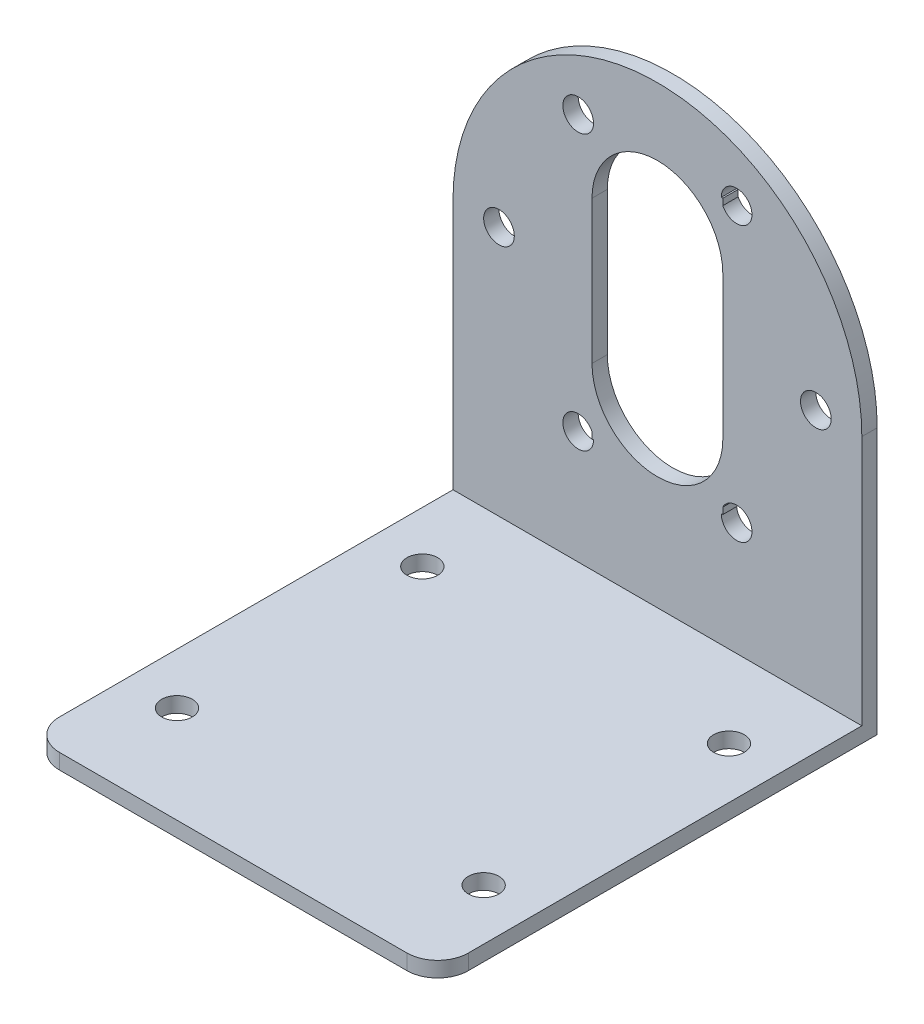
ISO-10303-21;
HEADER;
FILE_DESCRIPTION(('STEP AP214'),'2;1');
FILE_NAME('part.step','',(''),(''),'','','');
FILE_SCHEMA(('AUTOMOTIVE_DESIGN { 1 0 10303 214 1 1 1 1 }'));
ENDSEC;
DATA;
#1=APPLICATION_CONTEXT('core data for automotive mechanical design processes');
#2=APPLICATION_PROTOCOL_DEFINITION('international standard','automotive_design',2000,#1);
#3=PRODUCT_CONTEXT('',#1,'mechanical');
#4=PRODUCT('Part','Part','',(#3));
#5=PRODUCT_RELATED_PRODUCT_CATEGORY('part','',(#4));
#6=PRODUCT_DEFINITION_FORMATION('','',#4);
#7=PRODUCT_DEFINITION_CONTEXT('part definition',#1,'design');
#8=PRODUCT_DEFINITION('design','',#6,#7);
#9=PRODUCT_DEFINITION_SHAPE('','',#8);
#10=(LENGTH_UNIT() NAMED_UNIT(*) SI_UNIT(.MILLI.,.METRE.));
#11=(NAMED_UNIT(*) PLANE_ANGLE_UNIT() SI_UNIT($,.RADIAN.));
#12=(NAMED_UNIT(*) SI_UNIT($,.STERADIAN.) SOLID_ANGLE_UNIT());
#13=UNCERTAINTY_MEASURE_WITH_UNIT(LENGTH_MEASURE(1.E-05),#10,'distance_accuracy_value','');
#14=(GEOMETRIC_REPRESENTATION_CONTEXT(3) GLOBAL_UNCERTAINTY_ASSIGNED_CONTEXT((#13)) GLOBAL_UNIT_ASSIGNED_CONTEXT((#10,
#11,#12)) REPRESENTATION_CONTEXT('',''));
#15=CARTESIAN_POINT('',(0.,0.,0.));
#16=DIRECTION('',(0.,0.,1.));
#17=DIRECTION('',(1.,0.,0.));
#18=AXIS2_PLACEMENT_3D('',#15,#16,#17);
#19=CARTESIAN_POINT('',(20.,26.,1.5));
#20=DIRECTION('',(0.,0.,1.));
#21=DIRECTION('',(1.,0.,0.));
#22=AXIS2_PLACEMENT_3D('',#19,#20,#21);
#23=PLANE('',#22);
#24=CARTESIAN_POINT('',(4.49999999999999,26.,1.5));
#25=DIRECTION('',(0.,0.,1.));
#26=DIRECTION('',(1.,0.,0.));
#27=AXIS2_PLACEMENT_3D('',#24,#25,#26);
#28=CIRCLE('',#27,1.5);
#29=CARTESIAN_POINT('',(5.99999999999999,26.,1.5));
#30=VERTEX_POINT('',#29);
#31=EDGE_CURVE('E339',#30,#30,#28,.T.);
#32=ORIENTED_EDGE('',*,*,#31,.F.);
#33=EDGE_LOOP('',(#32));
#34=FACE_BOUND('',#33,.T.);
#35=CARTESIAN_POINT('',(35.5,25.9999999999999,1.5));
#36=DIRECTION('',(0.,0.,1.));
#37=DIRECTION('',(1.,0.,0.));
#38=AXIS2_PLACEMENT_3D('',#35,#36,#37);
#39=CIRCLE('',#38,1.5);
#40=CARTESIAN_POINT('',(37.,25.9999999999999,1.5));
#41=VERTEX_POINT('',#40);
#42=EDGE_CURVE('E604',#41,#41,#39,.T.);
#43=ORIENTED_EDGE('',*,*,#42,.F.);
#44=EDGE_LOOP('',(#43));
#45=FACE_BOUND('',#44,.T.);
#46=CARTESIAN_POINT('',(12.25,39.4233937586588,1.5));
#47=DIRECTION('',(0.,0.,1.));
#48=DIRECTION('',(1.,0.,0.));
#49=AXIS2_PLACEMENT_3D('',#46,#47,#48);
#50=CIRCLE('',#49,1.5);
#51=CARTESIAN_POINT('',(13.75,39.4233937586588,1.5));
#52=VERTEX_POINT('',#51);
#53=EDGE_CURVE('E297',#52,#52,#50,.T.);
#54=ORIENTED_EDGE('',*,*,#53,.F.);
#55=EDGE_LOOP('',(#54));
#56=FACE_BOUND('',#55,.T.);
#57=DIRECTION('',(0.,-1.,0.));
#58=VECTOR('',#57,1.);
#59=CARTESIAN_POINT('',(26.3999999999996,-2.90569260220752E-13,1.5));
#60=LINE('',#59,#58);
#61=CARTESIAN_POINT('',(26.4,39.4,1.5));
#62=VERTEX_POINT('',#61);
#63=CARTESIAN_POINT('',(26.4000000000003,38.7695589171272,1.5));
#64=VERTEX_POINT('',#63);
#65=EDGE_CURVE('E263',#62,#64,#60,.T.);
#66=ORIENTED_EDGE('',*,*,#65,.F.);
#67=DIRECTION('',(1.,0.,0.));
#68=VECTOR('',#67,1.);
#69=CARTESIAN_POINT('',(0.,39.4,1.5));
#70=LINE('',#69,#68);
#71=CARTESIAN_POINT('',(26.2501824337421,39.4,1.5));
#72=VERTEX_POINT('',#71);
#73=EDGE_CURVE('E274',#72,#62,#70,.T.);
#74=ORIENTED_EDGE('',*,*,#73,.F.);
#75=CARTESIAN_POINT('',(27.7500000000001,39.4233937586588,1.5));
#76=DIRECTION('',(0.,0.,1.));
#77=DIRECTION('',(1.,0.,0.));
#78=AXIS2_PLACEMENT_3D('',#75,#76,#77);
#79=CIRCLE('',#78,1.5);
#80=EDGE_CURVE('E279',#64,#72,#79,.T.);
#81=ORIENTED_EDGE('',*,*,#80,.F.);
#82=EDGE_LOOP('',(#66,#74,#81));
#83=FACE_BOUND('',#82,.T.);
#84=DIRECTION('',(-1.,0.,0.));
#85=VECTOR('',#84,1.);
#86=CARTESIAN_POINT('',(0.,1.5,1.5));
#87=LINE('',#86,#85);
#88=CARTESIAN_POINT('',(40.,1.5,1.5));
#89=VERTEX_POINT('',#88);
#90=CARTESIAN_POINT('',(0.,1.5,1.5));
#91=VERTEX_POINT('',#90);
#92=EDGE_CURVE('E365',#89,#91,#87,.T.);
#93=ORIENTED_EDGE('',*,*,#92,.F.);
#94=DIRECTION('',(0.,1.,0.));
#95=VECTOR('',#94,1.);
#96=CARTESIAN_POINT('',(40.,0.,1.5));
#97=LINE('',#96,#95);
#98=CARTESIAN_POINT('',(40.,26.,1.5));
#99=VERTEX_POINT('',#98);
#100=EDGE_CURVE('E382',#89,#99,#97,.T.);
#101=ORIENTED_EDGE('',*,*,#100,.T.);
#102=CARTESIAN_POINT('',(20.,26.,1.5));
#103=DIRECTION('',(0.,0.,1.));
#104=DIRECTION('',(1.,0.,0.));
#105=AXIS2_PLACEMENT_3D('',#102,#103,#104);
#106=CIRCLE('',#105,20.);
#107=CARTESIAN_POINT('',(0.,26.,1.5));
#108=VERTEX_POINT('',#107);
#109=EDGE_CURVE('E385',#99,#108,#106,.T.);
#110=ORIENTED_EDGE('',*,*,#109,.T.);
#111=DIRECTION('',(0.,-1.,0.));
#112=VECTOR('',#111,1.);
#113=CARTESIAN_POINT('',(0.,0.,1.5));
#114=LINE('',#113,#112);
#115=EDGE_CURVE('E379',#108,#91,#114,.T.);
#116=ORIENTED_EDGE('',*,*,#115,.T.);
#117=EDGE_LOOP('',(#93,#101,#110,#116));
#118=FACE_BOUND('',#117,.T.);
#119=CARTESIAN_POINT('',(27.7499999999999,12.5766062413411,1.5));
#120=DIRECTION('',(0.,0.,1.));
#121=DIRECTION('',(1.,0.,0.));
#122=AXIS2_PLACEMENT_3D('',#119,#120,#121);
#123=CIRCLE('',#122,1.5);
#124=CARTESIAN_POINT('',(26.250182433742,12.6,1.5));
#125=VERTEX_POINT('',#124);
#126=CARTESIAN_POINT('',(26.4,13.2304410828729,1.5));
#127=VERTEX_POINT('',#126);
#128=EDGE_CURVE('E300',#125,#127,#123,.T.);
#129=ORIENTED_EDGE('',*,*,#128,.F.);
#130=DIRECTION('',(1.,0.,0.));
#131=VECTOR('',#130,1.);
#132=CARTESIAN_POINT('',(0.,12.6,1.5));
#133=LINE('',#132,#131);
#134=CARTESIAN_POINT('',(26.4,12.6,1.5));
#135=VERTEX_POINT('',#134);
#136=EDGE_CURVE('E271',#125,#135,#133,.T.);
#137=ORIENTED_EDGE('',*,*,#136,.T.);
#138=DIRECTION('',(0.,-1.,0.));
#139=VECTOR('',#138,1.);
#140=CARTESIAN_POINT('',(26.4,0.,1.5));
#141=LINE('',#140,#139);
#142=EDGE_CURVE('E292',#127,#135,#141,.T.);
#143=ORIENTED_EDGE('',*,*,#142,.F.);
#144=EDGE_LOOP('',(#129,#137,#143));
#145=FACE_BOUND('',#144,.T.);
#146=CARTESIAN_POINT('',(12.2499999999998,12.5766062413413,1.5));
#147=DIRECTION('',(0.,0.,1.));
#148=DIRECTION('',(1.,0.,0.));
#149=AXIS2_PLACEMENT_3D('',#146,#147,#148);
#150=CIRCLE('',#149,1.5);
#151=CARTESIAN_POINT('',(13.6,13.230441082872,1.5));
#152=VERTEX_POINT('',#151);
#153=CARTESIAN_POINT('',(13.7498175662578,12.6,1.5));
#154=VERTEX_POINT('',#153);
#155=EDGE_CURVE('E333',#152,#154,#150,.T.);
#156=ORIENTED_EDGE('',*,*,#155,.F.);
#157=DIRECTION('',(0.,-1.,0.));
#158=VECTOR('',#157,1.);
#159=CARTESIAN_POINT('',(13.6,0.,1.5));
#160=LINE('',#159,#158);
#161=CARTESIAN_POINT('',(13.6,12.6,1.5));
#162=VERTEX_POINT('',#161);
#163=EDGE_CURVE('E336',#152,#162,#160,.T.);
#164=ORIENTED_EDGE('',*,*,#163,.T.);
#165=DIRECTION('',(1.,0.,0.));
#166=VECTOR('',#165,1.);
#167=CARTESIAN_POINT('',(0.,12.6,1.5));
#168=LINE('',#167,#166);
#169=EDGE_CURVE('E327',#162,#154,#168,.T.);
#170=ORIENTED_EDGE('',*,*,#169,.T.);
#171=EDGE_LOOP('',(#156,#164,#170));
#172=FACE_BOUND('',#171,.T.);
#173=DIRECTION('',(0.,-1.,0.));
#174=VECTOR('',#173,1.);
#175=CARTESIAN_POINT('',(26.4,0.,1.5));
#176=LINE('',#175,#174);
#177=CARTESIAN_POINT('',(26.4,33.,1.5));
#178=VERTEX_POINT('',#177);
#179=CARTESIAN_POINT('',(26.4,19.,1.5));
#180=VERTEX_POINT('',#179);
#181=EDGE_CURVE('E317',#178,#180,#176,.T.);
#182=ORIENTED_EDGE('',*,*,#181,.T.);
#183=CARTESIAN_POINT('',(20.,19.,1.5));
#184=DIRECTION('',(0.,0.,1.));
#185=DIRECTION('',(1.,0.,0.));
#186=AXIS2_PLACEMENT_3D('',#183,#184,#185);
#187=CIRCLE('',#186,6.4);
#188=CARTESIAN_POINT('',(13.6,19.,1.5));
#189=VERTEX_POINT('',#188);
#190=EDGE_CURVE('E320',#180,#189,#187,.F.);
#191=ORIENTED_EDGE('',*,*,#190,.T.);
#192=DIRECTION('',(0.,-1.,0.));
#193=VECTOR('',#192,1.);
#194=CARTESIAN_POINT('',(13.6,0.,1.5));
#195=LINE('',#194,#193);
#196=CARTESIAN_POINT('',(13.6,33.,1.5));
#197=VERTEX_POINT('',#196);
#198=EDGE_CURVE('E308',#197,#189,#195,.T.);
#199=ORIENTED_EDGE('',*,*,#198,.F.);
#200=CARTESIAN_POINT('',(20.,33.,1.5));
#201=DIRECTION('',(0.,0.,1.));
#202=DIRECTION('',(1.,0.,0.));
#203=AXIS2_PLACEMENT_3D('',#200,#201,#202);
#204=CIRCLE('',#203,6.4);
#205=EDGE_CURVE('E314',#178,#197,#204,.T.);
#206=ORIENTED_EDGE('',*,*,#205,.F.);
#207=EDGE_LOOP('',(#182,#191,#199,#206));
#208=FACE_BOUND('',#207,.T.);
#209=ADVANCED_FACE('F116',(#34,#45,#56,#83,#118,#145,#172,#208),#23,.T.);
#210=CARTESIAN_POINT('',(20.,26.,0.));
#211=DIRECTION('',(0.,0.,1.));
#212=DIRECTION('',(1.,0.,0.));
#213=AXIS2_PLACEMENT_3D('',#210,#211,#212);
#214=PLANE('',#213);
#215=CARTESIAN_POINT('',(4.49999999999999,26.,0.));
#216=DIRECTION('',(0.,0.,1.));
#217=DIRECTION('',(1.,0.,0.));
#218=AXIS2_PLACEMENT_3D('',#215,#216,#217);
#219=CIRCLE('',#218,1.5);
#220=CARTESIAN_POINT('',(5.99999999999999,26.,0.));
#221=VERTEX_POINT('',#220);
#222=EDGE_CURVE('E350',#221,#221,#219,.T.);
#223=ORIENTED_EDGE('',*,*,#222,.T.);
#224=EDGE_LOOP('',(#223));
#225=FACE_BOUND('',#224,.T.);
#226=CARTESIAN_POINT('',(35.5,25.9999999999999,0.));
#227=DIRECTION('',(0.,0.,1.));
#228=DIRECTION('',(1.,0.,0.));
#229=AXIS2_PLACEMENT_3D('',#226,#227,#228);
#230=CIRCLE('',#229,1.5);
#231=CARTESIAN_POINT('',(37.,25.9999999999999,0.));
#232=VERTEX_POINT('',#231);
#233=EDGE_CURVE('E441',#232,#232,#230,.T.);
#234=ORIENTED_EDGE('',*,*,#233,.T.);
#235=EDGE_LOOP('',(#234));
#236=FACE_BOUND('',#235,.T.);
#237=CARTESIAN_POINT('',(12.25,39.4233937586588,0.));
#238=DIRECTION('',(0.,0.,1.));
#239=DIRECTION('',(1.,0.,0.));
#240=AXIS2_PLACEMENT_3D('',#237,#238,#239);
#241=CIRCLE('',#240,1.5);
#242=CARTESIAN_POINT('',(13.75,39.4233937586588,0.));
#243=VERTEX_POINT('',#242);
#244=EDGE_CURVE('E438',#243,#243,#241,.T.);
#245=ORIENTED_EDGE('',*,*,#244,.T.);
#246=EDGE_LOOP('',(#245));
#247=FACE_BOUND('',#246,.T.);
#248=DIRECTION('',(0.,-1.,0.));
#249=VECTOR('',#248,1.);
#250=CARTESIAN_POINT('',(13.6,26.,0.));
#251=LINE('',#250,#249);
#252=CARTESIAN_POINT('',(13.6,13.230441082872,0.));
#253=VERTEX_POINT('',#252);
#254=CARTESIAN_POINT('',(13.6,12.6,0.));
#255=VERTEX_POINT('',#254);
#256=EDGE_CURVE('E425',#253,#255,#251,.T.);
#257=ORIENTED_EDGE('',*,*,#256,.F.);
#258=CARTESIAN_POINT('',(12.2499999999998,12.5766062413413,0.));
#259=DIRECTION('',(0.,0.,1.));
#260=DIRECTION('',(1.,0.,0.));
#261=AXIS2_PLACEMENT_3D('',#258,#259,#260);
#262=CIRCLE('',#261,1.5);
#263=CARTESIAN_POINT('',(13.7498175662578,12.6,0.));
#264=VERTEX_POINT('',#263);
#265=EDGE_CURVE('E419',#253,#264,#262,.T.);
#266=ORIENTED_EDGE('',*,*,#265,.T.);
#267=DIRECTION('',(1.,0.,0.));
#268=VECTOR('',#267,1.);
#269=CARTESIAN_POINT('',(20.,12.6,0.));
#270=LINE('',#269,#268);
#271=EDGE_CURVE('E422',#255,#264,#270,.T.);
#272=ORIENTED_EDGE('',*,*,#271,.F.);
#273=EDGE_LOOP('',(#257,#266,#272));
#274=FACE_BOUND('',#273,.T.);
#275=DIRECTION('',(1.,0.,0.));
#276=VECTOR('',#275,1.);
#277=CARTESIAN_POINT('',(20.,39.4,0.));
#278=LINE('',#277,#276);
#279=CARTESIAN_POINT('',(26.2501824337421,39.4,0.));
#280=VERTEX_POINT('',#279);
#281=CARTESIAN_POINT('',(26.4,39.4,0.));
#282=VERTEX_POINT('',#281);
#283=EDGE_CURVE('E416',#280,#282,#278,.T.);
#284=ORIENTED_EDGE('',*,*,#283,.T.);
#285=DIRECTION('',(0.,-1.,0.));
#286=VECTOR('',#285,1.);
#287=CARTESIAN_POINT('',(26.3999999999999,25.9999999999999,0.));
#288=LINE('',#287,#286);
#289=CARTESIAN_POINT('',(26.4,38.7695589171271,0.));
#290=VERTEX_POINT('',#289);
#291=EDGE_CURVE('E266',#282,#290,#288,.T.);
#292=ORIENTED_EDGE('',*,*,#291,.T.);
#293=CARTESIAN_POINT('',(27.7500000000001,39.4233937586588,0.));
#294=DIRECTION('',(0.,0.,1.));
#295=DIRECTION('',(1.,0.,0.));
#296=AXIS2_PLACEMENT_3D('',#293,#294,#295);
#297=CIRCLE('',#296,1.5);
#298=EDGE_CURVE('E413',#290,#280,#297,.T.);
#299=ORIENTED_EDGE('',*,*,#298,.T.);
#300=EDGE_LOOP('',(#284,#292,#299));
#301=FACE_BOUND('',#300,.T.);
#302=DIRECTION('',(0.,-1.,0.));
#303=VECTOR('',#302,1.);
#304=CARTESIAN_POINT('',(0.,0.,0.));
#305=LINE('',#304,#303);
#306=CARTESIAN_POINT('',(0.,26.,0.));
#307=VERTEX_POINT('',#306);
#308=CARTESIAN_POINT('',(0.,0.,0.));
#309=VERTEX_POINT('',#308);
#310=EDGE_CURVE('E378',#307,#309,#305,.T.);
#311=ORIENTED_EDGE('',*,*,#310,.F.);
#312=CARTESIAN_POINT('',(20.,26.,0.));
#313=DIRECTION('',(0.,0.,1.));
#314=DIRECTION('',(1.,0.,0.));
#315=AXIS2_PLACEMENT_3D('',#312,#313,#314);
#316=CIRCLE('',#315,20.);
#317=CARTESIAN_POINT('',(40.,26.,0.));
#318=VERTEX_POINT('',#317);
#319=EDGE_CURVE('E383',#318,#307,#316,.T.);
#320=ORIENTED_EDGE('',*,*,#319,.F.);
#321=DIRECTION('',(0.,1.,0.));
#322=VECTOR('',#321,1.);
#323=CARTESIAN_POINT('',(40.,0.,0.));
#324=LINE('',#323,#322);
#325=CARTESIAN_POINT('',(40.,0.,0.));
#326=VERTEX_POINT('',#325);
#327=EDGE_CURVE('E393',#326,#318,#324,.T.);
#328=ORIENTED_EDGE('',*,*,#327,.F.);
#329=DIRECTION('',(1.,0.,0.));
#330=VECTOR('',#329,1.);
#331=CARTESIAN_POINT('',(0.,0.,0.));
#332=LINE('',#331,#330);
#333=EDGE_CURVE('E390',#309,#326,#332,.T.);
#334=ORIENTED_EDGE('',*,*,#333,.F.);
#335=EDGE_LOOP('',(#311,#320,#328,#334));
#336=FACE_BOUND('',#335,.T.);
#337=DIRECTION('',(1.,0.,0.));
#338=VECTOR('',#337,1.);
#339=CARTESIAN_POINT('',(20.,12.6,0.));
#340=LINE('',#339,#338);
#341=CARTESIAN_POINT('',(26.250182433742,12.6,0.));
#342=VERTEX_POINT('',#341);
#343=CARTESIAN_POINT('',(26.4,12.6,0.));
#344=VERTEX_POINT('',#343);
#345=EDGE_CURVE('E411',#342,#344,#340,.T.);
#346=ORIENTED_EDGE('',*,*,#345,.F.);
#347=CARTESIAN_POINT('',(27.7499999999999,12.5766062413411,0.));
#348=DIRECTION('',(0.,0.,1.));
#349=DIRECTION('',(1.,0.,0.));
#350=AXIS2_PLACEMENT_3D('',#347,#348,#349);
#351=CIRCLE('',#350,1.5);
#352=CARTESIAN_POINT('',(26.4000000000002,13.2304410828729,0.));
#353=VERTEX_POINT('',#352);
#354=EDGE_CURVE('E405',#342,#353,#351,.T.);
#355=ORIENTED_EDGE('',*,*,#354,.T.);
#356=DIRECTION('',(0.,-1.,0.));
#357=VECTOR('',#356,1.);
#358=CARTESIAN_POINT('',(26.4,26.,0.));
#359=LINE('',#358,#357);
#360=EDGE_CURVE('E408',#353,#344,#359,.T.);
#361=ORIENTED_EDGE('',*,*,#360,.T.);
#362=EDGE_LOOP('',(#346,#355,#361));
#363=FACE_BOUND('',#362,.T.);
#364=CARTESIAN_POINT('',(20.,19.,0.));
#365=DIRECTION('',(0.,0.,1.));
#366=DIRECTION('',(1.,0.,0.));
#367=AXIS2_PLACEMENT_3D('',#364,#365,#366);
#368=CIRCLE('',#367,6.4);
#369=CARTESIAN_POINT('',(26.4,19.,0.));
#370=VERTEX_POINT('',#369);
#371=CARTESIAN_POINT('',(13.6,19.,0.));
#372=VERTEX_POINT('',#371);
#373=EDGE_CURVE('E435',#370,#372,#368,.F.);
#374=ORIENTED_EDGE('',*,*,#373,.F.);
#375=DIRECTION('',(0.,-1.,0.));
#376=VECTOR('',#375,1.);
#377=CARTESIAN_POINT('',(26.4,26.,0.));
#378=LINE('',#377,#376);
#379=CARTESIAN_POINT('',(26.4,33.,0.));
#380=VERTEX_POINT('',#379);
#381=EDGE_CURVE('E427',#380,#370,#378,.T.);
#382=ORIENTED_EDGE('',*,*,#381,.F.);
#383=CARTESIAN_POINT('',(20.,33.,0.));
#384=DIRECTION('',(0.,0.,1.));
#385=DIRECTION('',(1.,0.,0.));
#386=AXIS2_PLACEMENT_3D('',#383,#384,#385);
#387=CIRCLE('',#386,6.4);
#388=CARTESIAN_POINT('',(13.6,33.,0.));
#389=VERTEX_POINT('',#388);
#390=EDGE_CURVE('E429',#380,#389,#387,.T.);
#391=ORIENTED_EDGE('',*,*,#390,.T.);
#392=DIRECTION('',(0.,-1.,0.));
#393=VECTOR('',#392,1.);
#394=CARTESIAN_POINT('',(13.6,26.,0.));
#395=LINE('',#394,#393);
#396=EDGE_CURVE('E432',#389,#372,#395,.T.);
#397=ORIENTED_EDGE('',*,*,#396,.T.);
#398=EDGE_LOOP('',(#374,#382,#391,#397));
#399=FACE_BOUND('',#398,.T.);
#400=ADVANCED_FACE('F485',(#225,#236,#247,#274,#301,#336,#363,#399),#214,.F.);
#401=CARTESIAN_POINT('',(0.,0.,1.5));
#402=DIRECTION('',(1.,0.,0.));
#403=DIRECTION('',(0.,0.,-1.));
#404=AXIS2_PLACEMENT_3D('',#401,#402,#403);
#405=PLANE('',#404);
#406=DIRECTION('',(0.,0.,-1.));
#407=VECTOR('',#406,1.);
#408=CARTESIAN_POINT('',(0.,0.,1.5));
#409=LINE('',#408,#407);
#410=CARTESIAN_POINT('',(0.,0.,40.));
#411=VERTEX_POINT('',#410);
#412=EDGE_CURVE('E403',#411,#309,#409,.T.);
#413=ORIENTED_EDGE('',*,*,#412,.F.);
#414=DIRECTION('',(0.,-1.,0.));
#415=VECTOR('',#414,1.);
#416=CARTESIAN_POINT('',(0.,0.,40.));
#417=LINE('',#416,#415);
#418=CARTESIAN_POINT('',(0.,1.5,40.));
#419=VERTEX_POINT('',#418);
#420=EDGE_CURVE('E12',#411,#419,#417,.F.);
#421=ORIENTED_EDGE('',*,*,#420,.T.);
#422=DIRECTION('',(0.,0.,-1.));
#423=VECTOR('',#422,1.);
#424=CARTESIAN_POINT('',(0.,1.5,43.));
#425=LINE('',#424,#423);
#426=EDGE_CURVE('E372',#419,#91,#425,.T.);
#427=ORIENTED_EDGE('',*,*,#426,.T.);
#428=ORIENTED_EDGE('',*,*,#115,.F.);
#429=DIRECTION('',(0.,0.,-1.));
#430=VECTOR('',#429,1.);
#431=CARTESIAN_POINT('',(0.,26.,1.5));
#432=LINE('',#431,#430);
#433=EDGE_CURVE('E387',#108,#307,#432,.T.);
#434=ORIENTED_EDGE('',*,*,#433,.T.);
#435=ORIENTED_EDGE('',*,*,#310,.T.);
#436=EDGE_LOOP('',(#413,#421,#427,#428,#434,#435));
#437=FACE_BOUND('',#436,.T.);
#438=ADVANCED_FACE('F480',(#437),#405,.F.);
#439=CARTESIAN_POINT('',(0.,0.,1.5));
#440=DIRECTION('',(0.,1.,0.));
#441=DIRECTION('',(0.,0.,1.));
#442=AXIS2_PLACEMENT_3D('',#439,#440,#441);
#443=PLANE('',#442);
#444=CARTESIAN_POINT('',(35.,0.,33.5));
#445=DIRECTION('',(0.,1.,0.));
#446=DIRECTION('',(0.,0.,1.));
#447=AXIS2_PLACEMENT_3D('',#444,#445,#446);
#448=CIRCLE('',#447,1.5);
#449=CARTESIAN_POINT('',(35.,0.,35.));
#450=VERTEX_POINT('',#449);
#451=EDGE_CURVE('E362',#450,#450,#448,.T.);
#452=ORIENTED_EDGE('',*,*,#451,.T.);
#453=EDGE_LOOP('',(#452));
#454=FACE_BOUND('',#453,.T.);
#455=CARTESIAN_POINT('',(35.,0.,9.5));
#456=DIRECTION('',(0.,1.,0.));
#457=DIRECTION('',(0.,0.,1.));
#458=AXIS2_PLACEMENT_3D('',#455,#456,#457);
#459=CIRCLE('',#458,1.5);
#460=CARTESIAN_POINT('',(35.,0.,11.));
#461=VERTEX_POINT('',#460);
#462=EDGE_CURVE('E359',#461,#461,#459,.T.);
#463=ORIENTED_EDGE('',*,*,#462,.T.);
#464=EDGE_LOOP('',(#463));
#465=FACE_BOUND('',#464,.T.);
#466=CARTESIAN_POINT('',(5.,0.,9.5));
#467=DIRECTION('',(0.,1.,0.));
#468=DIRECTION('',(0.,0.,1.));
#469=AXIS2_PLACEMENT_3D('',#466,#467,#468);
#470=CIRCLE('',#469,1.5);
#471=CARTESIAN_POINT('',(5.,0.,11.));
#472=VERTEX_POINT('',#471);
#473=EDGE_CURVE('E356',#472,#472,#470,.T.);
#474=ORIENTED_EDGE('',*,*,#473,.T.);
#475=EDGE_LOOP('',(#474));
#476=FACE_BOUND('',#475,.T.);
#477=CARTESIAN_POINT('',(5.,0.,33.5));
#478=DIRECTION('',(0.,1.,0.));
#479=DIRECTION('',(0.,0.,1.));
#480=AXIS2_PLACEMENT_3D('',#477,#478,#479);
#481=CIRCLE('',#480,1.5);
#482=CARTESIAN_POINT('',(5.,0.,35.));
#483=VERTEX_POINT('',#482);
#484=EDGE_CURVE('E353',#483,#483,#481,.T.);
#485=ORIENTED_EDGE('',*,*,#484,.T.);
#486=EDGE_LOOP('',(#485));
#487=FACE_BOUND('',#486,.T.);
#488=DIRECTION('',(0.,0.,-1.));
#489=VECTOR('',#488,1.);
#490=CARTESIAN_POINT('',(40.,0.,1.5));
#491=LINE('',#490,#489);
#492=CARTESIAN_POINT('',(40.,0.,40.));
#493=VERTEX_POINT('',#492);
#494=EDGE_CURVE('E401',#493,#326,#491,.T.);
#495=ORIENTED_EDGE('',*,*,#494,.F.);
#496=CARTESIAN_POINT('',(37.,0.,40.));
#497=DIRECTION('',(0.,1.,0.));
#498=DIRECTION('',(0.,0.,1.));
#499=AXIS2_PLACEMENT_3D('',#496,#497,#498);
#500=CIRCLE('',#499,3.);
#501=CARTESIAN_POINT('',(37.,0.,43.));
#502=VERTEX_POINT('',#501);
#503=EDGE_CURVE('E124',#493,#502,#500,.F.);
#504=ORIENTED_EDGE('',*,*,#503,.T.);
#505=DIRECTION('',(1.,0.,0.));
#506=VECTOR('',#505,1.);
#507=CARTESIAN_POINT('',(0.,0.,43.));
#508=LINE('',#507,#506);
#509=CARTESIAN_POINT('',(3.,0.,43.));
#510=VERTEX_POINT('',#509);
#511=EDGE_CURVE('E366',#510,#502,#508,.T.);
#512=ORIENTED_EDGE('',*,*,#511,.F.);
#513=CARTESIAN_POINT('',(3.,0.,40.));
#514=DIRECTION('',(0.,1.,0.));
#515=DIRECTION('',(0.,0.,1.));
#516=AXIS2_PLACEMENT_3D('',#513,#514,#515);
#517=CIRCLE('',#516,3.);
#518=EDGE_CURVE('E131',#510,#411,#517,.F.);
#519=ORIENTED_EDGE('',*,*,#518,.T.);
#520=ORIENTED_EDGE('',*,*,#412,.T.);
#521=ORIENTED_EDGE('',*,*,#333,.T.);
#522=EDGE_LOOP('',(#495,#504,#512,#519,#520,#521));
#523=FACE_BOUND('',#522,.T.);
#524=ADVANCED_FACE('F457',(#454,#465,#476,#487,#523),#443,.F.);
#525=CARTESIAN_POINT('',(40.,0.,1.5));
#526=DIRECTION('',(-1.,0.,0.));
#527=DIRECTION('',(0.,0.,1.));
#528=AXIS2_PLACEMENT_3D('',#525,#526,#527);
#529=PLANE('',#528);
#530=DIRECTION('',(0.,0.,-1.));
#531=VECTOR('',#530,1.);
#532=CARTESIAN_POINT('',(40.,1.5,43.));
#533=LINE('',#532,#531);
#534=CARTESIAN_POINT('',(40.,1.5,40.));
#535=VERTEX_POINT('',#534);
#536=EDGE_CURVE('E376',#535,#89,#533,.T.);
#537=ORIENTED_EDGE('',*,*,#536,.F.);
#538=DIRECTION('',(0.,1.,0.));
#539=VECTOR('',#538,1.);
#540=CARTESIAN_POINT('',(40.,0.,40.));
#541=LINE('',#540,#539);
#542=EDGE_CURVE('E139',#535,#493,#541,.F.);
#543=ORIENTED_EDGE('',*,*,#542,.T.);
#544=ORIENTED_EDGE('',*,*,#494,.T.);
#545=ORIENTED_EDGE('',*,*,#327,.T.);
#546=DIRECTION('',(0.,0.,-1.));
#547=VECTOR('',#546,1.);
#548=CARTESIAN_POINT('',(40.,26.,1.5));
#549=LINE('',#548,#547);
#550=EDGE_CURVE('E398',#99,#318,#549,.T.);
#551=ORIENTED_EDGE('',*,*,#550,.F.);
#552=ORIENTED_EDGE('',*,*,#100,.F.);
#553=EDGE_LOOP('',(#537,#543,#544,#545,#551,#552));
#554=FACE_BOUND('',#553,.T.);
#555=ADVANCED_FACE('F469',(#554),#529,.F.);
#556=CARTESIAN_POINT('',(20.,26.,1.5));
#557=DIRECTION('',(0.,0.,-1.));
#558=DIRECTION('',(-1.,0.,0.));
#559=AXIS2_PLACEMENT_3D('',#556,#557,#558);
#560=CYLINDRICAL_SURFACE('',#559,20.);
#561=ORIENTED_EDGE('',*,*,#319,.T.);
#562=ORIENTED_EDGE('',*,*,#433,.F.);
#563=ORIENTED_EDGE('',*,*,#109,.F.);
#564=ORIENTED_EDGE('',*,*,#550,.T.);
#565=EDGE_LOOP('',(#561,#562,#563,#564));
#566=FACE_BOUND('',#565,.T.);
#567=ADVANCED_FACE('F489',(#566),#560,.T.);
#568=CARTESIAN_POINT('',(0.,1.5,43.));
#569=DIRECTION('',(0.,-1.,0.));
#570=DIRECTION('',(0.,0.,-1.));
#571=AXIS2_PLACEMENT_3D('',#568,#569,#570);
#572=PLANE('',#571);
#573=CARTESIAN_POINT('',(35.,1.5,33.5));
#574=DIRECTION('',(0.,1.,0.));
#575=DIRECTION('',(0.,0.,1.));
#576=AXIS2_PLACEMENT_3D('',#573,#574,#575);
#577=CIRCLE('',#576,1.5);
#578=CARTESIAN_POINT('',(35.,1.5,35.));
#579=VERTEX_POINT('',#578);
#580=EDGE_CURVE('E347',#579,#579,#577,.T.);
#581=ORIENTED_EDGE('',*,*,#580,.F.);
#582=EDGE_LOOP('',(#581));
#583=FACE_BOUND('',#582,.T.);
#584=CARTESIAN_POINT('',(35.,1.5,9.5));
#585=DIRECTION('',(0.,1.,0.));
#586=DIRECTION('',(0.,0.,1.));
#587=AXIS2_PLACEMENT_3D('',#584,#585,#586);
#588=CIRCLE('',#587,1.5);
#589=CARTESIAN_POINT('',(35.,1.5,11.));
#590=VERTEX_POINT('',#589);
#591=EDGE_CURVE('E344',#590,#590,#588,.T.);
#592=ORIENTED_EDGE('',*,*,#591,.F.);
#593=EDGE_LOOP('',(#592));
#594=FACE_BOUND('',#593,.T.);
#595=CARTESIAN_POINT('',(5.,1.5,9.5));
#596=DIRECTION('',(0.,1.,0.));
#597=DIRECTION('',(0.,0.,1.));
#598=AXIS2_PLACEMENT_3D('',#595,#596,#597);
#599=CIRCLE('',#598,1.5);
#600=CARTESIAN_POINT('',(5.,1.5,11.));
#601=VERTEX_POINT('',#600);
#602=EDGE_CURVE('E340',#601,#601,#599,.T.);
#603=ORIENTED_EDGE('',*,*,#602,.F.);
#604=EDGE_LOOP('',(#603));
#605=FACE_BOUND('',#604,.T.);
#606=CARTESIAN_POINT('',(5.,1.5,33.5));
#607=DIRECTION('',(0.,1.,0.));
#608=DIRECTION('',(0.,0.,1.));
#609=AXIS2_PLACEMENT_3D('',#606,#607,#608);
#610=CIRCLE('',#609,1.5);
#611=CARTESIAN_POINT('',(5.,1.5,35.));
#612=VERTEX_POINT('',#611);
#613=EDGE_CURVE('E343',#612,#612,#610,.T.);
#614=ORIENTED_EDGE('',*,*,#613,.F.);
#615=EDGE_LOOP('',(#614));
#616=FACE_BOUND('',#615,.T.);
#617=DIRECTION('',(-1.,0.,0.));
#618=VECTOR('',#617,1.);
#619=CARTESIAN_POINT('',(0.,1.5,43.));
#620=LINE('',#619,#618);
#621=CARTESIAN_POINT('',(37.,1.5,43.));
#622=VERTEX_POINT('',#621);
#623=CARTESIAN_POINT('',(3.,1.5,43.));
#624=VERTEX_POINT('',#623);
#625=EDGE_CURVE('E369',#622,#624,#620,.T.);
#626=ORIENTED_EDGE('',*,*,#625,.F.);
#627=CARTESIAN_POINT('',(37.,1.5,40.));
#628=DIRECTION('',(0.,-1.,0.));
#629=DIRECTION('',(0.,0.,-1.));
#630=AXIS2_PLACEMENT_3D('',#627,#628,#629);
#631=CIRCLE('',#630,3.);
#632=EDGE_CURVE('E453',#622,#535,#631,.F.);
#633=ORIENTED_EDGE('',*,*,#632,.T.);
#634=ORIENTED_EDGE('',*,*,#536,.T.);
#635=ORIENTED_EDGE('',*,*,#92,.T.);
#636=ORIENTED_EDGE('',*,*,#426,.F.);
#637=CARTESIAN_POINT('',(3.,1.5,40.));
#638=DIRECTION('',(0.,-1.,0.));
#639=DIRECTION('',(0.,0.,-1.));
#640=AXIS2_PLACEMENT_3D('',#637,#638,#639);
#641=CIRCLE('',#640,3.);
#642=EDGE_CURVE('E451',#419,#624,#641,.F.);
#643=ORIENTED_EDGE('',*,*,#642,.T.);
#644=EDGE_LOOP('',(#626,#633,#634,#635,#636,#643));
#645=FACE_BOUND('',#644,.T.);
#646=ADVANCED_FACE('F466',(#583,#594,#605,#616,#645),#572,.F.);
#647=CARTESIAN_POINT('',(0.,0.,43.));
#648=DIRECTION('',(0.,0.,-1.));
#649=DIRECTION('',(-1.,0.,0.));
#650=AXIS2_PLACEMENT_3D('',#647,#648,#649);
#651=PLANE('',#650);
#652=ORIENTED_EDGE('',*,*,#511,.T.);
#653=DIRECTION('',(0.,1.,0.));
#654=VECTOR('',#653,1.);
#655=CARTESIAN_POINT('',(37.,0.,43.));
#656=LINE('',#655,#654);
#657=EDGE_CURVE('E448',#502,#622,#656,.T.);
#658=ORIENTED_EDGE('',*,*,#657,.T.);
#659=ORIENTED_EDGE('',*,*,#625,.T.);
#660=DIRECTION('',(0.,-1.,0.));
#661=VECTOR('',#660,1.);
#662=CARTESIAN_POINT('',(3.,0.,43.));
#663=LINE('',#662,#661);
#664=EDGE_CURVE('E437',#624,#510,#663,.T.);
#665=ORIENTED_EDGE('',*,*,#664,.T.);
#666=EDGE_LOOP('',(#652,#658,#659,#665));
#667=FACE_BOUND('',#666,.T.);
#668=ADVANCED_FACE('F461',(#667),#651,.F.);
#669=CARTESIAN_POINT('',(5.,-40.,33.5));
#670=DIRECTION('',(0.,1.,0.));
#671=DIRECTION('',(0.,0.,1.));
#672=AXIS2_PLACEMENT_3D('',#669,#670,#671);
#673=CYLINDRICAL_SURFACE('',#672,1.5);
#674=ORIENTED_EDGE('',*,*,#613,.T.);
#675=EDGE_LOOP('',(#674));
#676=FACE_BOUND('',#675,.T.);
#677=ORIENTED_EDGE('',*,*,#484,.F.);
#678=EDGE_LOOP('',(#677));
#679=FACE_BOUND('',#678,.T.);
#680=ADVANCED_FACE('F512',(#676,#679),#673,.F.);
#681=CARTESIAN_POINT('',(5.,-40.,9.5));
#682=DIRECTION('',(0.,1.,0.));
#683=DIRECTION('',(0.,0.,1.));
#684=AXIS2_PLACEMENT_3D('',#681,#682,#683);
#685=CYLINDRICAL_SURFACE('',#684,1.5);
#686=ORIENTED_EDGE('',*,*,#602,.T.);
#687=EDGE_LOOP('',(#686));
#688=FACE_BOUND('',#687,.T.);
#689=ORIENTED_EDGE('',*,*,#473,.F.);
#690=EDGE_LOOP('',(#689));
#691=FACE_BOUND('',#690,.T.);
#692=ADVANCED_FACE('F515',(#688,#691),#685,.F.);
#693=CARTESIAN_POINT('',(35.,-40.,9.5));
#694=DIRECTION('',(0.,1.,0.));
#695=DIRECTION('',(0.,0.,1.));
#696=AXIS2_PLACEMENT_3D('',#693,#694,#695);
#697=CYLINDRICAL_SURFACE('',#696,1.5);
#698=ORIENTED_EDGE('',*,*,#591,.T.);
#699=EDGE_LOOP('',(#698));
#700=FACE_BOUND('',#699,.T.);
#701=ORIENTED_EDGE('',*,*,#462,.F.);
#702=EDGE_LOOP('',(#701));
#703=FACE_BOUND('',#702,.T.);
#704=ADVANCED_FACE('F521',(#700,#703),#697,.F.);
#705=CARTESIAN_POINT('',(35.,-40.,33.5));
#706=DIRECTION('',(0.,1.,0.));
#707=DIRECTION('',(0.,0.,1.));
#708=AXIS2_PLACEMENT_3D('',#705,#706,#707);
#709=CYLINDRICAL_SURFACE('',#708,1.5);
#710=ORIENTED_EDGE('',*,*,#580,.T.);
#711=EDGE_LOOP('',(#710));
#712=FACE_BOUND('',#711,.T.);
#713=ORIENTED_EDGE('',*,*,#451,.F.);
#714=EDGE_LOOP('',(#713));
#715=FACE_BOUND('',#714,.T.);
#716=ADVANCED_FACE('F517',(#712,#715),#709,.F.);
#717=CARTESIAN_POINT('',(0.,12.6,-40.));
#718=DIRECTION('',(0.,-1.,0.));
#719=DIRECTION('',(0.,0.,-1.));
#720=AXIS2_PLACEMENT_3D('',#717,#718,#719);
#721=PLANE('',#720);
#722=ORIENTED_EDGE('',*,*,#345,.T.);
#723=DIRECTION('',(0.,0.,1.));
#724=VECTOR('',#723,1.);
#725=CARTESIAN_POINT('',(26.4,12.6,-40.));
#726=LINE('',#725,#724);
#727=EDGE_CURVE('E295',#344,#135,#726,.T.);
#728=ORIENTED_EDGE('',*,*,#727,.T.);
#729=ORIENTED_EDGE('',*,*,#136,.F.);
#730=DIRECTION('',(0.,0.,1.));
#731=VECTOR('',#730,1.);
#732=CARTESIAN_POINT('',(26.250182433742,12.6,-40.));
#733=LINE('',#732,#731);
#734=EDGE_CURVE('E289',#342,#125,#733,.T.);
#735=ORIENTED_EDGE('',*,*,#734,.F.);
#736=EDGE_LOOP('',(#722,#728,#729,#735));
#737=FACE_BOUND('',#736,.T.);
#738=ADVANCED_FACE('F520',(#737),#721,.T.);
#739=CARTESIAN_POINT('',(26.4,0.,-40.));
#740=DIRECTION('',(-1.,0.,0.));
#741=DIRECTION('',(0.,0.,1.));
#742=AXIS2_PLACEMENT_3D('',#739,#740,#741);
#743=PLANE('',#742);
#744=DIRECTION('',(0.,0.,1.));
#745=VECTOR('',#744,1.);
#746=CARTESIAN_POINT('',(26.4,13.2304410828729,-40.));
#747=LINE('',#746,#745);
#748=EDGE_CURVE('E293',#353,#127,#747,.T.);
#749=ORIENTED_EDGE('',*,*,#748,.T.);
#750=ORIENTED_EDGE('',*,*,#142,.T.);
#751=ORIENTED_EDGE('',*,*,#727,.F.);
#752=ORIENTED_EDGE('',*,*,#360,.F.);
#753=EDGE_LOOP('',(#749,#750,#751,#752));
#754=FACE_BOUND('',#753,.T.);
#755=ADVANCED_FACE('F559',(#754),#743,.F.);
#756=CARTESIAN_POINT('',(27.7499999999999,12.5766062413411,-40.));
#757=DIRECTION('',(0.,0.,1.));
#758=DIRECTION('',(1.,0.,0.));
#759=AXIS2_PLACEMENT_3D('',#756,#757,#758);
#760=CYLINDRICAL_SURFACE('',#759,1.5);
#761=ORIENTED_EDGE('',*,*,#734,.T.);
#762=ORIENTED_EDGE('',*,*,#128,.T.);
#763=ORIENTED_EDGE('',*,*,#748,.F.);
#764=ORIENTED_EDGE('',*,*,#354,.F.);
#765=EDGE_LOOP('',(#761,#762,#763,#764));
#766=FACE_BOUND('',#765,.T.);
#767=ADVANCED_FACE('F562',(#766),#760,.F.);
#768=CARTESIAN_POINT('',(26.3999999999996,-2.90569260220752E-13,-40.));
#769=DIRECTION('',(-1.,0.,0.));
#770=DIRECTION('',(0.,-1.,0.));
#771=AXIS2_PLACEMENT_3D('',#768,#769,#770);
#772=PLANE('',#771);
#773=DIRECTION('',(0.,0.,1.));
#774=VECTOR('',#773,1.);
#775=CARTESIAN_POINT('',(26.4,39.4,-40.));
#776=LINE('',#775,#774);
#777=EDGE_CURVE('E258',#282,#62,#776,.T.);
#778=ORIENTED_EDGE('',*,*,#777,.T.);
#779=ORIENTED_EDGE('',*,*,#65,.T.);
#780=DIRECTION('',(0.,0.,1.));
#781=VECTOR('',#780,1.);
#782=CARTESIAN_POINT('',(26.4,38.7695589171271,-40.));
#783=LINE('',#782,#781);
#784=EDGE_CURVE('E280',#290,#64,#783,.T.);
#785=ORIENTED_EDGE('',*,*,#784,.F.);
#786=ORIENTED_EDGE('',*,*,#291,.F.);
#787=EDGE_LOOP('',(#778,#779,#785,#786));
#788=FACE_BOUND('',#787,.T.);
#789=ADVANCED_FACE('F260',(#788),#772,.F.);
#790=CARTESIAN_POINT('',(0.,39.4,-40.));
#791=DIRECTION('',(0.,-1.,0.));
#792=DIRECTION('',(0.,0.,-1.));
#793=AXIS2_PLACEMENT_3D('',#790,#791,#792);
#794=PLANE('',#793);
#795=DIRECTION('',(0.,0.,1.));
#796=VECTOR('',#795,1.);
#797=CARTESIAN_POINT('',(26.2501824337421,39.4,-40.));
#798=LINE('',#797,#796);
#799=EDGE_CURVE('E270',#280,#72,#798,.T.);
#800=ORIENTED_EDGE('',*,*,#799,.T.);
#801=ORIENTED_EDGE('',*,*,#73,.T.);
#802=ORIENTED_EDGE('',*,*,#777,.F.);
#803=ORIENTED_EDGE('',*,*,#283,.F.);
#804=EDGE_LOOP('',(#800,#801,#802,#803));
#805=FACE_BOUND('',#804,.T.);
#806=ADVANCED_FACE('F275',(#805),#794,.F.);
#807=CARTESIAN_POINT('',(27.7500000000001,39.4233937586588,-40.));
#808=DIRECTION('',(0.,0.,1.));
#809=DIRECTION('',(1.,0.,0.));
#810=AXIS2_PLACEMENT_3D('',#807,#808,#809);
#811=CYLINDRICAL_SURFACE('',#810,1.5);
#812=ORIENTED_EDGE('',*,*,#784,.T.);
#813=ORIENTED_EDGE('',*,*,#80,.T.);
#814=ORIENTED_EDGE('',*,*,#799,.F.);
#815=ORIENTED_EDGE('',*,*,#298,.F.);
#816=EDGE_LOOP('',(#812,#813,#814,#815));
#817=FACE_BOUND('',#816,.T.);
#818=ADVANCED_FACE('F541',(#817),#811,.F.);
#819=CARTESIAN_POINT('',(13.6,0.,-40.));
#820=DIRECTION('',(-1.,0.,0.));
#821=DIRECTION('',(0.,0.,1.));
#822=AXIS2_PLACEMENT_3D('',#819,#820,#821);
#823=PLANE('',#822);
#824=ORIENTED_EDGE('',*,*,#256,.T.);
#825=DIRECTION('',(0.,0.,1.));
#826=VECTOR('',#825,1.);
#827=CARTESIAN_POINT('',(13.6,12.6,-40.));
#828=LINE('',#827,#826);
#829=EDGE_CURVE('E323',#255,#162,#828,.T.);
#830=ORIENTED_EDGE('',*,*,#829,.T.);
#831=ORIENTED_EDGE('',*,*,#163,.F.);
#832=DIRECTION('',(0.,0.,1.));
#833=VECTOR('',#832,1.);
#834=CARTESIAN_POINT('',(13.6,13.230441082872,-40.));
#835=LINE('',#834,#833);
#836=EDGE_CURVE('E324',#253,#152,#835,.T.);
#837=ORIENTED_EDGE('',*,*,#836,.F.);
#838=EDGE_LOOP('',(#824,#830,#831,#837));
#839=FACE_BOUND('',#838,.T.);
#840=ADVANCED_FACE('F533',(#839),#823,.T.);
#841=CARTESIAN_POINT('',(0.,12.6,-40.));
#842=DIRECTION('',(0.,-1.,0.));
#843=DIRECTION('',(0.,0.,-1.));
#844=AXIS2_PLACEMENT_3D('',#841,#842,#843);
#845=PLANE('',#844);
#846=ORIENTED_EDGE('',*,*,#271,.T.);
#847=DIRECTION('',(0.,0.,1.));
#848=VECTOR('',#847,1.);
#849=CARTESIAN_POINT('',(13.7498175662578,12.6,-40.));
#850=LINE('',#849,#848);
#851=EDGE_CURVE('E328',#264,#154,#850,.T.);
#852=ORIENTED_EDGE('',*,*,#851,.T.);
#853=ORIENTED_EDGE('',*,*,#169,.F.);
#854=ORIENTED_EDGE('',*,*,#829,.F.);
#855=EDGE_LOOP('',(#846,#852,#853,#854));
#856=FACE_BOUND('',#855,.T.);
#857=ADVANCED_FACE('F529',(#856),#845,.T.);
#858=CARTESIAN_POINT('',(12.2499999999998,12.5766062413413,-40.));
#859=DIRECTION('',(0.,0.,1.));
#860=DIRECTION('',(1.,0.,0.));
#861=AXIS2_PLACEMENT_3D('',#858,#859,#860);
#862=CYLINDRICAL_SURFACE('',#861,1.5);
#863=ORIENTED_EDGE('',*,*,#836,.T.);
#864=ORIENTED_EDGE('',*,*,#155,.T.);
#865=ORIENTED_EDGE('',*,*,#851,.F.);
#866=ORIENTED_EDGE('',*,*,#265,.F.);
#867=EDGE_LOOP('',(#863,#864,#865,#866));
#868=FACE_BOUND('',#867,.T.);
#869=ADVANCED_FACE('F532',(#868),#862,.F.);
#870=CARTESIAN_POINT('',(20.,19.,-40.));
#871=DIRECTION('',(0.,0.,1.));
#872=DIRECTION('',(1.,0.,0.));
#873=AXIS2_PLACEMENT_3D('',#870,#871,#872);
#874=CYLINDRICAL_SURFACE('',#873,6.4);
#875=ORIENTED_EDGE('',*,*,#373,.T.);
#876=DIRECTION('',(0.,0.,1.));
#877=VECTOR('',#876,1.);
#878=CARTESIAN_POINT('',(13.6,19.,-40.));
#879=LINE('',#878,#877);
#880=EDGE_CURVE('E283',#372,#189,#879,.T.);
#881=ORIENTED_EDGE('',*,*,#880,.T.);
#882=ORIENTED_EDGE('',*,*,#190,.F.);
#883=DIRECTION('',(0.,0.,1.));
#884=VECTOR('',#883,1.);
#885=CARTESIAN_POINT('',(26.4,19.,-40.));
#886=LINE('',#885,#884);
#887=EDGE_CURVE('E305',#370,#180,#886,.T.);
#888=ORIENTED_EDGE('',*,*,#887,.F.);
#889=EDGE_LOOP('',(#875,#881,#882,#888));
#890=FACE_BOUND('',#889,.T.);
#891=ADVANCED_FACE('F537',(#890),#874,.F.);
#892=CARTESIAN_POINT('',(13.6,0.,-40.));
#893=DIRECTION('',(-1.,0.,0.));
#894=DIRECTION('',(0.,0.,1.));
#895=AXIS2_PLACEMENT_3D('',#892,#893,#894);
#896=PLANE('',#895);
#897=DIRECTION('',(0.,0.,1.));
#898=VECTOR('',#897,1.);
#899=CARTESIAN_POINT('',(13.6,33.,-40.));
#900=LINE('',#899,#898);
#901=EDGE_CURVE('E285',#389,#197,#900,.T.);
#902=ORIENTED_EDGE('',*,*,#901,.T.);
#903=ORIENTED_EDGE('',*,*,#198,.T.);
#904=ORIENTED_EDGE('',*,*,#880,.F.);
#905=ORIENTED_EDGE('',*,*,#396,.F.);
#906=EDGE_LOOP('',(#902,#903,#904,#905));
#907=FACE_BOUND('',#906,.T.);
#908=ADVANCED_FACE('F543',(#907),#896,.F.);
#909=CARTESIAN_POINT('',(20.,33.,-40.));
#910=DIRECTION('',(0.,0.,1.));
#911=DIRECTION('',(1.,0.,0.));
#912=AXIS2_PLACEMENT_3D('',#909,#910,#911);
#913=CYLINDRICAL_SURFACE('',#912,6.4);
#914=DIRECTION('',(0.,0.,1.));
#915=VECTOR('',#914,1.);
#916=CARTESIAN_POINT('',(26.4,33.,-40.));
#917=LINE('',#916,#915);
#918=EDGE_CURVE('E309',#380,#178,#917,.T.);
#919=ORIENTED_EDGE('',*,*,#918,.T.);
#920=ORIENTED_EDGE('',*,*,#205,.T.);
#921=ORIENTED_EDGE('',*,*,#901,.F.);
#922=ORIENTED_EDGE('',*,*,#390,.F.);
#923=EDGE_LOOP('',(#919,#920,#921,#922));
#924=FACE_BOUND('',#923,.T.);
#925=ADVANCED_FACE('F546',(#924),#913,.F.);
#926=CARTESIAN_POINT('',(26.4,0.,-40.));
#927=DIRECTION('',(-1.,0.,0.));
#928=DIRECTION('',(0.,0.,1.));
#929=AXIS2_PLACEMENT_3D('',#926,#927,#928);
#930=PLANE('',#929);
#931=ORIENTED_EDGE('',*,*,#381,.T.);
#932=ORIENTED_EDGE('',*,*,#887,.T.);
#933=ORIENTED_EDGE('',*,*,#181,.F.);
#934=ORIENTED_EDGE('',*,*,#918,.F.);
#935=EDGE_LOOP('',(#931,#932,#933,#934));
#936=FACE_BOUND('',#935,.T.);
#937=ADVANCED_FACE('F550',(#936),#930,.T.);
#938=CARTESIAN_POINT('',(12.25,39.4233937586588,-40.));
#939=DIRECTION('',(0.,0.,1.));
#940=DIRECTION('',(1.,0.,0.));
#941=AXIS2_PLACEMENT_3D('',#938,#939,#940);
#942=CYLINDRICAL_SURFACE('',#941,1.5);
#943=ORIENTED_EDGE('',*,*,#53,.T.);
#944=EDGE_LOOP('',(#943));
#945=FACE_BOUND('',#944,.T.);
#946=ORIENTED_EDGE('',*,*,#244,.F.);
#947=EDGE_LOOP('',(#946));
#948=FACE_BOUND('',#947,.T.);
#949=ADVANCED_FACE('F554',(#945,#948),#942,.F.);
#950=CARTESIAN_POINT('',(35.5,25.9999999999999,-40.));
#951=DIRECTION('',(0.,0.,1.));
#952=DIRECTION('',(1.,0.,0.));
#953=AXIS2_PLACEMENT_3D('',#950,#951,#952);
#954=CYLINDRICAL_SURFACE('',#953,1.5);
#955=ORIENTED_EDGE('',*,*,#42,.T.);
#956=EDGE_LOOP('',(#955));
#957=FACE_BOUND('',#956,.T.);
#958=ORIENTED_EDGE('',*,*,#233,.F.);
#959=EDGE_LOOP('',(#958));
#960=FACE_BOUND('',#959,.T.);
#961=ADVANCED_FACE('F577',(#957,#960),#954,.F.);
#962=CARTESIAN_POINT('',(4.49999999999999,26.,-40.));
#963=DIRECTION('',(0.,0.,1.));
#964=DIRECTION('',(1.,0.,0.));
#965=AXIS2_PLACEMENT_3D('',#962,#963,#964);
#966=CYLINDRICAL_SURFACE('',#965,1.5);
#967=ORIENTED_EDGE('',*,*,#31,.T.);
#968=EDGE_LOOP('',(#967));
#969=FACE_BOUND('',#968,.T.);
#970=ORIENTED_EDGE('',*,*,#222,.F.);
#971=EDGE_LOOP('',(#970));
#972=FACE_BOUND('',#971,.T.);
#973=ADVANCED_FACE('F580',(#969,#972),#966,.F.);
#974=CARTESIAN_POINT('',(37.,0.,40.));
#975=DIRECTION('',(0.,1.,0.));
#976=DIRECTION('',(0.,0.,1.));
#977=AXIS2_PLACEMENT_3D('',#974,#975,#976);
#978=CYLINDRICAL_SURFACE('',#977,3.);
#979=ORIENTED_EDGE('',*,*,#503,.F.);
#980=ORIENTED_EDGE('',*,*,#542,.F.);
#981=ORIENTED_EDGE('',*,*,#632,.F.);
#982=ORIENTED_EDGE('',*,*,#657,.F.);
#983=EDGE_LOOP('',(#979,#980,#981,#982));
#984=FACE_BOUND('',#983,.T.);
#985=ADVANCED_FACE('F464',(#984),#978,.T.);
#986=CARTESIAN_POINT('',(3.,0.,40.));
#987=DIRECTION('',(0.,-1.,0.));
#988=DIRECTION('',(0.,0.,-1.));
#989=AXIS2_PLACEMENT_3D('',#986,#987,#988);
#990=CYLINDRICAL_SURFACE('',#989,3.);
#991=ORIENTED_EDGE('',*,*,#642,.F.);
#992=ORIENTED_EDGE('',*,*,#420,.F.);
#993=ORIENTED_EDGE('',*,*,#518,.F.);
#994=ORIENTED_EDGE('',*,*,#664,.F.);
#995=EDGE_LOOP('',(#991,#992,#993,#994));
#996=FACE_BOUND('',#995,.T.);
#997=ADVANCED_FACE('F118',(#996),#990,.T.);
#998=CLOSED_SHELL('',(#209,#400,#438,#524,#555,#567,#646,#668,#680,#692,#704,#716,#738,#755,
#767,#789,#806,#818,#840,#857,#869,#891,#908,#925,#937,#949,#961,#973,#985,#997));
#999=MANIFOLD_SOLID_BREP('B2',#998);
#1000=ADVANCED_BREP_SHAPE_REPRESENTATION('',(#18,#999),#14);
#1001=SHAPE_DEFINITION_REPRESENTATION(#9,#1000);
ENDSEC;
END-ISO-10303-21;
